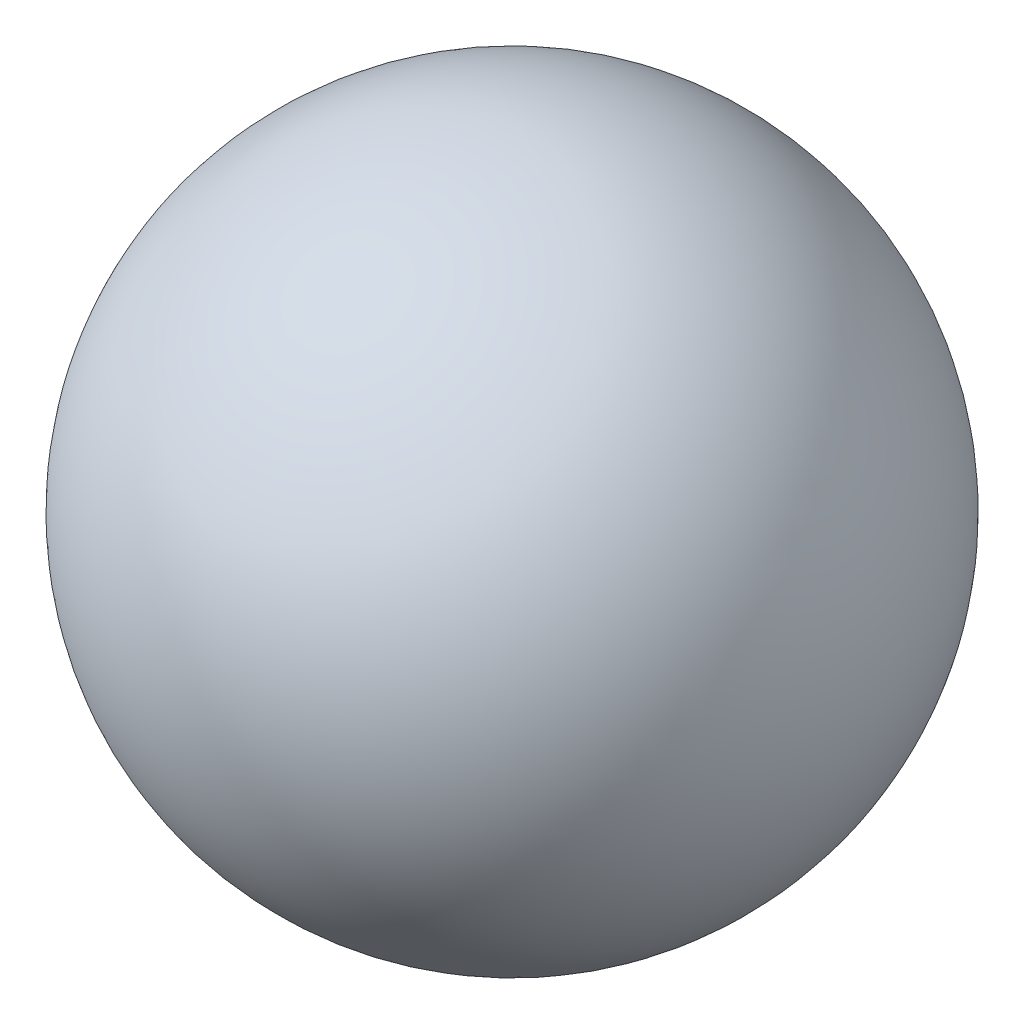
ISO-10303-21;
HEADER;
FILE_DESCRIPTION(('STEP AP214'),'2;1');
FILE_NAME('part.step','',(''),(''),'','','');
FILE_SCHEMA(('AUTOMOTIVE_DESIGN { 1 0 10303 214 1 1 1 1 }'));
ENDSEC;
DATA;
#1=APPLICATION_CONTEXT('core data for automotive mechanical design processes');
#2=APPLICATION_PROTOCOL_DEFINITION('international standard','automotive_design',2000,#1);
#3=PRODUCT_CONTEXT('',#1,'mechanical');
#4=PRODUCT('Part','Part','',(#3));
#5=PRODUCT_RELATED_PRODUCT_CATEGORY('part','',(#4));
#6=PRODUCT_DEFINITION_FORMATION('','',#4);
#7=PRODUCT_DEFINITION_CONTEXT('part definition',#1,'design');
#8=PRODUCT_DEFINITION('design','',#6,#7);
#9=PRODUCT_DEFINITION_SHAPE('','',#8);
#10=(LENGTH_UNIT() NAMED_UNIT(*) SI_UNIT(.MILLI.,.METRE.));
#11=(NAMED_UNIT(*) PLANE_ANGLE_UNIT() SI_UNIT($,.RADIAN.));
#12=(NAMED_UNIT(*) SI_UNIT($,.STERADIAN.) SOLID_ANGLE_UNIT());
#13=UNCERTAINTY_MEASURE_WITH_UNIT(LENGTH_MEASURE(1.E-05),#10,'distance_accuracy_value','');
#14=(GEOMETRIC_REPRESENTATION_CONTEXT(3) GLOBAL_UNCERTAINTY_ASSIGNED_CONTEXT((#13)) GLOBAL_UNIT_ASSIGNED_CONTEXT((#10,
#11,#12)) REPRESENTATION_CONTEXT('',''));
#15=CARTESIAN_POINT('',(0.,0.,0.));
#16=DIRECTION('',(0.,0.,1.));
#17=DIRECTION('',(1.,0.,0.));
#18=AXIS2_PLACEMENT_3D('',#15,#16,#17);
#19=CARTESIAN_POINT('',(0.,0.,0.));
#20=DIRECTION('',(1.,0.,0.));
#21=DIRECTION('',(0.,-1.,0.));
#22=AXIS2_PLACEMENT_3D('',#19,#20,#21);
#23=SPHERICAL_SURFACE('',#22,16.);
#24=CARTESIAN_POINT('',(16.,0.,0.));
#25=VERTEX_POINT('',#24);
#26=VERTEX_LOOP('',#25);
#27=FACE_BOUND('',#26,.T.);
#28=ADVANCED_FACE('F37',(#27),#23,.T.);
#29=CLOSED_SHELL('',(#28));
#30=MANIFOLD_SOLID_BREP('B2',#29);
#31=ADVANCED_BREP_SHAPE_REPRESENTATION('',(#18,#30),#14);
#32=SHAPE_DEFINITION_REPRESENTATION(#9,#31);
ENDSEC;
END-ISO-10303-21;
